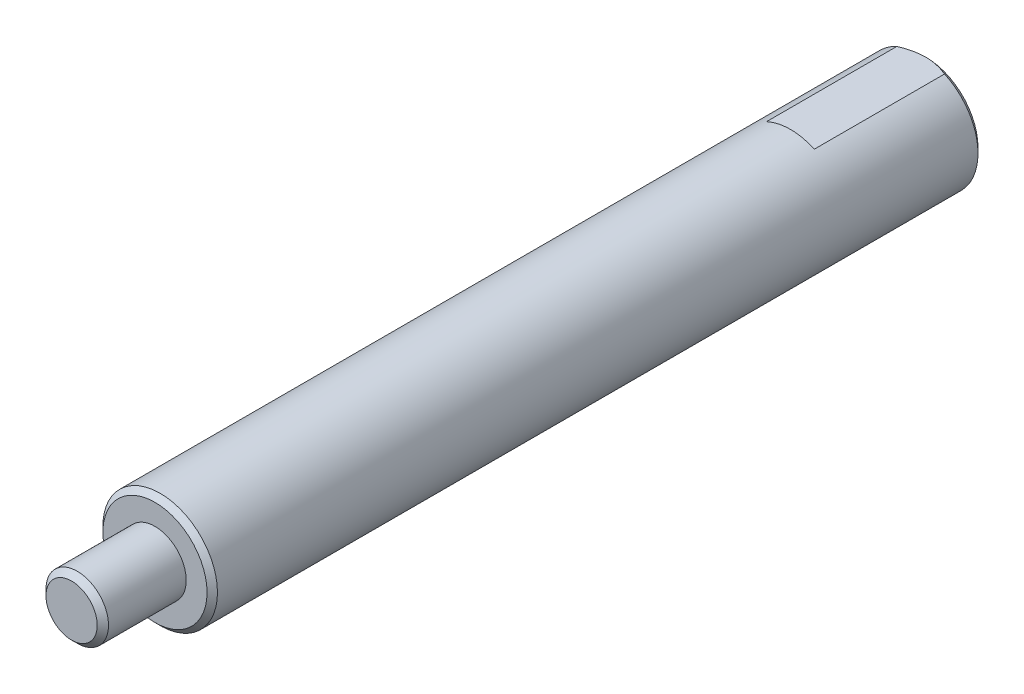
ISO-10303-21;
HEADER;
FILE_DESCRIPTION(('STEP AP214'),'2;1');
FILE_NAME('part.step','',(''),(''),'','','');
FILE_SCHEMA(('AUTOMOTIVE_DESIGN { 1 0 10303 214 1 1 1 1 }'));
ENDSEC;
DATA;
#1=APPLICATION_CONTEXT('core data for automotive mechanical design processes');
#2=APPLICATION_PROTOCOL_DEFINITION('international standard','automotive_design',2000,#1);
#3=PRODUCT_CONTEXT('',#1,'mechanical');
#4=PRODUCT('Part','Part','',(#3));
#5=PRODUCT_RELATED_PRODUCT_CATEGORY('part','',(#4));
#6=PRODUCT_DEFINITION_FORMATION('','',#4);
#7=PRODUCT_DEFINITION_CONTEXT('part definition',#1,'design');
#8=PRODUCT_DEFINITION('design','',#6,#7);
#9=PRODUCT_DEFINITION_SHAPE('','',#8);
#10=(LENGTH_UNIT() NAMED_UNIT(*) SI_UNIT(.MILLI.,.METRE.));
#11=(NAMED_UNIT(*) PLANE_ANGLE_UNIT() SI_UNIT($,.RADIAN.));
#12=(NAMED_UNIT(*) SI_UNIT($,.STERADIAN.) SOLID_ANGLE_UNIT());
#13=UNCERTAINTY_MEASURE_WITH_UNIT(LENGTH_MEASURE(1.E-05),#10,'distance_accuracy_value','');
#14=(GEOMETRIC_REPRESENTATION_CONTEXT(3) GLOBAL_UNCERTAINTY_ASSIGNED_CONTEXT((#13)) GLOBAL_UNIT_ASSIGNED_CONTEXT((#10,
#11,#12)) REPRESENTATION_CONTEXT('',''));
#15=CARTESIAN_POINT('',(0.,0.,0.));
#16=DIRECTION('',(0.,0.,1.));
#17=DIRECTION('',(1.,0.,0.));
#18=AXIS2_PLACEMENT_3D('',#15,#16,#17);
#19=CARTESIAN_POINT('',(0.,0.,0.499999999999987));
#20=DIRECTION('',(0.,0.,1.));
#21=DIRECTION('',(1.,0.,0.));
#22=AXIS2_PLACEMENT_3D('',#19,#20,#21);
#23=CONICAL_SURFACE('',#22,5.5,0.78539816339745);
#24=CARTESIAN_POINT('',(14.6848091307526,5.,10.5126921972504));
#25=CARTESIAN_POINT('',(14.4453208226167,5.,10.2859896541325));
#26=CARTESIAN_POINT('',(14.2055496886511,5.,10.0595855916861));
#27=CARTESIAN_POINT('',(13.7253433237666,5.,9.60748006149905));
#28=CARTESIAN_POINT('',(13.4849080888773,5.,9.38177859797621));
#29=CARTESIAN_POINT('',(12.7618962256915,5.,8.70536049882658));
#30=CARTESIAN_POINT('',(12.2781765081115,5.,8.25586410270802));
#31=CARTESIAN_POINT('',(11.2855202754839,5.,7.34194274282295));
#32=CARTESIAN_POINT('',(10.7764003173807,5.,6.87771631839148));
#33=CARTESIAN_POINT('',(10.0081237078525,5.,6.18705169530895));
#34=CARTESIAN_POINT('',(9.75140731219671,5.,5.95789999795168));
#35=CARTESIAN_POINT('',(9.23598125315536,5.,5.50185127115901));
#36=CARTESIAN_POINT('',(8.97727160895969,5.,5.27495422006517));
#37=CARTESIAN_POINT('',(8.45777334373332,5.,4.82431921159367));
#38=CARTESIAN_POINT('',(8.19698831207967,5.,4.60057712329845));
#39=CARTESIAN_POINT('',(7.67233583018279,5.,4.15670009726201));
#40=CARTESIAN_POINT('',(7.40846821574941,5.,3.93656535317608));
#41=CARTESIAN_POINT('',(6.87588577364978,5.,3.50025684420237));
#42=CARTESIAN_POINT('',(6.60715699098739,5.,3.28410005066111));
#43=CARTESIAN_POINT('',(6.06467897085509,5.,2.85824880719017));
#44=CARTESIAN_POINT('',(5.79093054202079,5.,2.64855333071796));
#45=CARTESIAN_POINT('',(5.24247824545985,5.,2.24225256251797));
#46=CARTESIAN_POINT('',(4.96790940819442,5.,2.04546689887262));
#47=CARTESIAN_POINT('',(4.54965992503179,5.,1.75937405975095));
#48=CARTESIAN_POINT('',(4.40911425501476,5.,1.66548481679902));
#49=CARTESIAN_POINT('',(4.12560555295647,5.,1.48143277641836));
#50=CARTESIAN_POINT('',(3.98264266122834,5.,1.39126976373143));
#51=CARTESIAN_POINT('',(3.69483138879456,5.,1.21601413329325));
#52=CARTESIAN_POINT('',(3.54999993591866,5.,1.130893824596));
#53=CARTESIAN_POINT('',(3.25720950323682,5.,0.966134750499005));
#54=CARTESIAN_POINT('',(3.10925012756179,5.,0.886496684425017));
#55=CARTESIAN_POINT('',(2.81011276522684,5.,0.734125373534754));
#56=CARTESIAN_POINT('',(2.65894061859049,5.,0.661380726321641));
#57=CARTESIAN_POINT('',(2.35286256329063,5.,0.524242686166215));
#58=CARTESIAN_POINT('',(2.1979578875244,5.,0.459846579258829));
#59=CARTESIAN_POINT('',(1.96757107505039,5.,0.372774300731312));
#60=CARTESIAN_POINT('',(1.8935907421667,5.,0.346101437024875));
#61=CARTESIAN_POINT('',(1.74478391072055,5.,0.295222264195111));
#62=CARTESIAN_POINT('',(1.6699573739292,5.,0.271016067006724));
#63=CARTESIAN_POINT('',(1.44419485912741,5.,0.20241783221721));
#64=CARTESIAN_POINT('',(1.29200049197922,5.,0.162055560028218));
#65=CARTESIAN_POINT('',(0.985646477349409,5.,0.0940487123556885));
#66=CARTESIAN_POINT('',(0.831502220582748,5.,0.066335485409596));
#67=CARTESIAN_POINT('',(0.521341182897074,5.,0.0247588689838173));
#68=CARTESIAN_POINT('',(0.365324622093103,5.,0.0108938672889431));
#69=CARTESIAN_POINT('',(0.0516160098074453,5.,-0.00220571628050168));
#70=CARTESIAN_POINT('',(-0.106080254029352,5.,-0.00134130349868332));
#71=CARTESIAN_POINT('',(-0.420679844237957,5.,0.0152055027274913));
#72=CARTESIAN_POINT('',(-0.577583163483161,5.,0.0308880291126336));
#73=CARTESIAN_POINT('',(-0.890071145811222,5.,0.0762385891218209));
#74=CARTESIAN_POINT('',(-1.04564624986794,5.,0.105971488681442));
#75=CARTESIAN_POINT('',(-1.35387421816561,5.,0.177884717281022));
#76=CARTESIAN_POINT('',(-1.50652647420588,5.,0.220067607636083));
#77=CARTESIAN_POINT('',(-1.89899228144049,5.,0.34355635845916));
#78=CARTESIAN_POINT('',(-2.13618939052783,5.,0.43315513583937));
#79=CARTESIAN_POINT('',(-2.60192397109251,5.,0.632544932175513));
#80=CARTESIAN_POINT('',(-2.83045405488686,5.,0.742352730382461));
#81=CARTESIAN_POINT('',(-3.16847602424729,5.,0.918609391765225));
#82=CARTESIAN_POINT('',(-3.28087217249437,5.,0.979600606049442));
#83=CARTESIAN_POINT('',(-3.50386518493594,5.,1.10479681410001));
#84=CARTESIAN_POINT('',(-3.61446202600279,5.,1.16900184913246));
#85=CARTESIAN_POINT('',(-3.8339612658412,5.,1.30012039469567));
#86=CARTESIAN_POINT('',(-3.94286443721366,5.,1.36703261693912));
#87=CARTESIAN_POINT('',(-4.15918024646885,5.,1.50320934076161));
#88=CARTESIAN_POINT('',(-4.26659294268099,5.,1.57247374992055));
#89=CARTESIAN_POINT('',(-4.62241235734309,5.,1.80671898738884));
#90=CARTESIAN_POINT('',(-4.86786587008812,5.,1.97619150842304));
#91=CARTESIAN_POINT('',(-5.35312692377562,5.,2.32306349681885));
#92=CARTESIAN_POINT('',(-5.59293322072365,5.,2.5004646862587));
#93=CARTESIAN_POINT('',(-6.06824445724704,5.,2.86127560728365));
#94=CARTESIAN_POINT('',(-6.30374612411139,5.,3.04468963665742));
#95=CARTESIAN_POINT('',(-6.77116765089326,5.,3.41597165684269));
#96=CARTESIAN_POINT('',(-7.00308779793934,5.,3.60383928751785));
#97=CARTESIAN_POINT('',(-7.46479831203283,5.,3.98364854892019));
#98=CARTESIAN_POINT('',(-7.69457957218839,5.,4.17560122632345));
#99=CARTESIAN_POINT('',(-8.15180534086165,5.,4.56227258082257));
#100=CARTESIAN_POINT('',(-8.37924980937879,5.,4.75699130513138));
#101=CARTESIAN_POINT('',(-8.83212152767317,5.,5.14856830192779));
#102=CARTESIAN_POINT('',(-9.05754957794669,5.,5.34542564979234));
#103=CARTESIAN_POINT('',(-9.50680949169871,5.,5.740954496332));
#104=CARTESIAN_POINT('',(-9.73064134364098,5.,5.93962600809503));
#105=CARTESIAN_POINT('',(-10.3554269609869,5.,6.4979230401996));
#106=CARTESIAN_POINT('',(-10.754889456792,5.,6.85921712232002));
#107=CARTESIAN_POINT('',(-11.550652043519,5.,7.58535654201273));
#108=CARTESIAN_POINT('',(-11.9469517546504,5.,7.95020229473564));
#109=CARTESIAN_POINT('',(-12.7346046209227,5.,8.68021687945507));
#110=CARTESIAN_POINT('',(-13.1259732089032,5.,9.0453690788511));
#111=CARTESIAN_POINT('',(-13.9067337252457,5.,9.77766414097995));
#112=CARTESIAN_POINT('',(-14.2961259422759,5.,10.1448066957958));
#113=CARTESIAN_POINT('',(-14.6848091307526,5.,10.5126921972504));
#114=B_SPLINE_CURVE_WITH_KNOTS('',3,(#24,#25,#26,#27,#28,#29,#30,#31,#32,#33,#34,#35,#36,#37,
#38,#39,#40,#41,#42,#43,#44,#45,#46,#47,#48,#49,#50,#51,#52,#53,#54,#55,#56,#57,#58,#59,#60,#61,
#62,#63,#64,#65,#66,#67,#68,#69,#70,#71,#72,#73,#74,#75,#76,#77,#78,#79,#80,#81,#82,#83,#84,#85,
#86,#87,#88,#89,#90,#91,#92,#93,#94,#95,#96,#97,#98,#99,#100,#101,#102,#103,#104,#105,#106,#107,
#108,#109,#110,#111,#112,#113),.UNSPECIFIED.,.F.,.F.,(4,2,2,2,2,2,2,2,2,2,2,2,2,2,2,2,2,2,2,2,2,
2,2,2,2,2,2,2,2,2,2,2,2,2,2,2,2,2,2,2,2,2,2,2,4),(0.,0.989311923310714,1.97862977419092,
3.95959337600444,6.02651317448656,7.05884240046668,8.09116170015311,9.12197286482421,
10.1528391870693,11.1873903696083,12.2217763312279,13.2349233326133,13.7419424161499,
14.2489321689684,14.7528143978997,15.256760784397,15.759858485699,16.2627922263955,
16.4986794127492,16.7345772986728,17.2064516788896,17.6757336299653,18.1449609407031,
18.6173431093418,19.0897295159999,19.5643184047903,20.039004998071,20.7982977886037,
21.5582238763945,21.941816072922,22.3254131961146,22.7088298733653,23.0922315031281,
23.9868071792121,24.8815781072258,25.7770031658049,26.6723560620082,27.5705534283762,
28.4687661443107,29.3666048627681,30.2644500636279,31.8802558929101,33.4962529155443,
35.1020309687598,36.7075673131427),.UNSPECIFIED.);
#115=CARTESIAN_POINT('',(2.29128784747799,5.,0.499999999999968));
#116=VERTEX_POINT('',#115);
#117=CARTESIAN_POINT('',(0.,5.00000000000001,0.));
#118=VERTEX_POINT('',#117);
#119=EDGE_CURVE('E56',#116,#118,#114,.T.);
#120=ORIENTED_EDGE('',*,*,#119,.F.);
#121=CARTESIAN_POINT('',(0.,0.,0.499999999999987));
#122=DIRECTION('',(0.,0.,1.));
#123=DIRECTION('',(1.,0.,0.));
#124=AXIS2_PLACEMENT_3D('',#121,#122,#123);
#125=CIRCLE('',#124,5.5);
#126=CARTESIAN_POINT('',(2.29128784747792,-5.,0.499999999999986));
#127=VERTEX_POINT('',#126);
#128=EDGE_CURVE('E125',#127,#116,#125,.T.);
#129=ORIENTED_EDGE('',*,*,#128,.F.);
#130=CARTESIAN_POINT('',(-14.6848091307526,-5.,10.5126921972504));
#131=CARTESIAN_POINT('',(-14.4453208226167,-5.,10.2859896541325));
#132=CARTESIAN_POINT('',(-14.2055496886511,-5.,10.0595855916861));
#133=CARTESIAN_POINT('',(-13.7253433237666,-5.,9.60748006149905));
#134=CARTESIAN_POINT('',(-13.4849080888773,-5.,9.38177859797621));
#135=CARTESIAN_POINT('',(-12.7618962256915,-5.,8.70536049882658));
#136=CARTESIAN_POINT('',(-12.2781765081115,-5.,8.25586410270802));
#137=CARTESIAN_POINT('',(-11.2855202754839,-5.,7.34194274282295));
#138=CARTESIAN_POINT('',(-10.7764003173807,-5.,6.87771631839148));
#139=CARTESIAN_POINT('',(-10.0081237078525,-5.,6.18705169530895));
#140=CARTESIAN_POINT('',(-9.75140731219672,-5.,5.95789999795169));
#141=CARTESIAN_POINT('',(-9.23598125315536,-5.,5.50185127115901));
#142=CARTESIAN_POINT('',(-8.9772716089597,-5.,5.27495422006518));
#143=CARTESIAN_POINT('',(-8.45777334373332,-5.,4.82431921159367));
#144=CARTESIAN_POINT('',(-8.19698831207967,-5.,4.60057712329845));
#145=CARTESIAN_POINT('',(-7.6723358301828,-5.,4.15670009726201));
#146=CARTESIAN_POINT('',(-7.40846821574941,-5.,3.93656535317608));
#147=CARTESIAN_POINT('',(-6.87588577364978,-5.,3.50025684420237));
#148=CARTESIAN_POINT('',(-6.60715699098739,-5.,3.28410005066111));
#149=CARTESIAN_POINT('',(-6.0646789708551,-5.,2.85824880719017));
#150=CARTESIAN_POINT('',(-5.79093054202079,-5.,2.64855333071797));
#151=CARTESIAN_POINT('',(-5.24247824545985,-5.,2.24225256251797));
#152=CARTESIAN_POINT('',(-4.96790940819442,-5.,2.04546689887262));
#153=CARTESIAN_POINT('',(-4.5496599250318,-5.,1.75937405975095));
#154=CARTESIAN_POINT('',(-4.40911425501477,-5.,1.66548481679902));
#155=CARTESIAN_POINT('',(-4.12560555295648,-5.,1.48143277641836));
#156=CARTESIAN_POINT('',(-3.98264266122835,-5.,1.39126976373143));
#157=CARTESIAN_POINT('',(-3.69483138879457,-5.,1.21601413329326));
#158=CARTESIAN_POINT('',(-3.54999993591867,-5.,1.13089382459601));
#159=CARTESIAN_POINT('',(-3.25720950323683,-5.,0.966134750499011));
#160=CARTESIAN_POINT('',(-3.1092501275618,-5.,0.886496684425023));
#161=CARTESIAN_POINT('',(-2.81011276522685,-5.,0.734125373534759));
#162=CARTESIAN_POINT('',(-2.6589406185905,-5.,0.661380726321646));
#163=CARTESIAN_POINT('',(-2.35286256329064,-5.,0.52424268616622));
#164=CARTESIAN_POINT('',(-2.19795788752441,-5.,0.459846579258833));
#165=CARTESIAN_POINT('',(-1.9675710750504,-5.,0.372774300731315));
#166=CARTESIAN_POINT('',(-1.89359074216671,-5.,0.346101437024878));
#167=CARTESIAN_POINT('',(-1.74478391072056,-5.,0.295222264195114));
#168=CARTESIAN_POINT('',(-1.66995737392921,-5.,0.271016067006727));
#169=CARTESIAN_POINT('',(-1.44419485912741,-5.,0.202417832217213));
#170=CARTESIAN_POINT('',(-1.29200049197923,-5.,0.16205556002822));
#171=CARTESIAN_POINT('',(-0.985646477349418,-5.,0.0940487123556907));
#172=CARTESIAN_POINT('',(-0.831502220582757,-5.,0.0663354854095982));
#173=CARTESIAN_POINT('',(-0.521341182897083,-5.,0.0247588689838186));
#174=CARTESIAN_POINT('',(-0.365324622093111,-5.,0.0108938672889437));
#175=CARTESIAN_POINT('',(-0.0516160098074518,-5.,-0.00220571628050229));
#176=CARTESIAN_POINT('',(0.106080254029347,-5.,-0.00134130349868432));
#177=CARTESIAN_POINT('',(0.420679844237952,-5.,0.0152055027274903));
#178=CARTESIAN_POINT('',(0.577583163483156,-5.,0.0308880291126329));
#179=CARTESIAN_POINT('',(0.890071145811216,-5.,0.0762385891218198));
#180=CARTESIAN_POINT('',(1.04564624986793,-5.,0.10597148868144));
#181=CARTESIAN_POINT('',(1.3538742181656,-5.,0.17788471728102));
#182=CARTESIAN_POINT('',(1.50652647420588,-5.,0.220067607636081));
#183=CARTESIAN_POINT('',(1.89899228144048,-5.,0.343556358459158));
#184=CARTESIAN_POINT('',(2.13618939052782,-5.,0.433155135839368));
#185=CARTESIAN_POINT('',(2.60192397109251,-5.,0.63254493217551));
#186=CARTESIAN_POINT('',(2.83045405488685,-5.,0.742352730382457));
#187=CARTESIAN_POINT('',(3.16847602424728,-5.,0.918609391765221));
#188=CARTESIAN_POINT('',(3.28087217249436,-5.,0.979600606049437));
#189=CARTESIAN_POINT('',(3.50386518493593,-5.,1.1047968141));
#190=CARTESIAN_POINT('',(3.61446202600278,-5.,1.16900184913246));
#191=CARTESIAN_POINT('',(3.83396126584119,-5.,1.30012039469567));
#192=CARTESIAN_POINT('',(3.94286443721365,-5.,1.36703261693911));
#193=CARTESIAN_POINT('',(4.15918024646884,-5.,1.5032093407616));
#194=CARTESIAN_POINT('',(4.26659294268098,-5.,1.57247374992054));
#195=CARTESIAN_POINT('',(4.62241235734308,-5.,1.80671898738884));
#196=CARTESIAN_POINT('',(4.86786587008811,-5.,1.97619150842303));
#197=CARTESIAN_POINT('',(5.35312692377561,-5.,2.32306349681884));
#198=CARTESIAN_POINT('',(5.59293322072363,-5.,2.5004646862587));
#199=CARTESIAN_POINT('',(6.06824445724703,-5.,2.86127560728364));
#200=CARTESIAN_POINT('',(6.30374612411138,-5.,3.04468963665741));
#201=CARTESIAN_POINT('',(6.77116765089325,-5.,3.41597165684268));
#202=CARTESIAN_POINT('',(7.00308779793934,-5.,3.60383928751784));
#203=CARTESIAN_POINT('',(7.46479831203282,-5.,3.98364854892018));
#204=CARTESIAN_POINT('',(7.69457957218838,-5.,4.17560122632344));
#205=CARTESIAN_POINT('',(8.15180534086164,-5.,4.56227258082257));
#206=CARTESIAN_POINT('',(8.37924980937878,-5.,4.75699130513138));
#207=CARTESIAN_POINT('',(8.83212152767316,-5.,5.14856830192779));
#208=CARTESIAN_POINT('',(9.05754957794669,-5.,5.34542564979233));
#209=CARTESIAN_POINT('',(9.50680949169871,-5.,5.74095449633199));
#210=CARTESIAN_POINT('',(9.73064134364097,-5.,5.93962600809503));
#211=CARTESIAN_POINT('',(10.3554269609869,-5.,6.4979230401996));
#212=CARTESIAN_POINT('',(10.754889456792,-5.,6.85921712232001));
#213=CARTESIAN_POINT('',(11.550652043519,-5.,7.58535654201273));
#214=CARTESIAN_POINT('',(11.9469517546504,-5.,7.95020229473563));
#215=CARTESIAN_POINT('',(12.7346046209227,-5.,8.68021687945506));
#216=CARTESIAN_POINT('',(13.1259732089032,-5.,9.04536907885109));
#217=CARTESIAN_POINT('',(13.9067337252457,-5.,9.77766414097995));
#218=CARTESIAN_POINT('',(14.2961259422759,-5.,10.1448066957958));
#219=CARTESIAN_POINT('',(14.6848091307526,-5.,10.5126921972504));
#220=B_SPLINE_CURVE_WITH_KNOTS('',3,(#130,#131,#132,#133,#134,#135,#136,#137,#138,#139,#140,
#141,#142,#143,#144,#145,#146,#147,#148,#149,#150,#151,#152,#153,#154,#155,#156,#157,#158,#159,
#160,#161,#162,#163,#164,#165,#166,#167,#168,#169,#170,#171,#172,#173,#174,#175,#176,#177,#178,
#179,#180,#181,#182,#183,#184,#185,#186,#187,#188,#189,#190,#191,#192,#193,#194,#195,#196,#197,
#198,#199,#200,#201,#202,#203,#204,#205,#206,#207,#208,#209,#210,#211,#212,#213,#214,#215,#216,
#217,#218,#219),.UNSPECIFIED.,.F.,.F.,(4,2,2,2,2,2,2,2,2,2,2,2,2,2,2,2,2,2,2,2,2,2,2,2,2,2,2,2,
2,2,2,2,2,2,2,2,2,2,2,2,2,2,2,2,4),(0.,0.98931192331071,1.97862977419091,3.95959337600444,
6.02651317448655,7.05884240046668,8.0911617001531,9.1219728648242,10.1528391870693,
11.1873903696083,12.2217763312279,13.2349233326133,13.7419424161499,14.2489321689684,
14.7528143978997,15.2567607843969,15.759858485699,16.2627922263955,16.4986794127492,
16.7345772986728,17.2064516788896,17.6757336299653,18.1449609407031,18.6173431093418,
19.0897295159999,19.5643184047903,20.0390049980709,20.7982977886037,21.5582238763945,
21.941816072922,22.3254131961146,22.7088298733652,23.092231503128,23.9868071792121,
24.8815781072258,25.7770031658048,26.6723560620081,27.5705534283762,28.4687661443107,
29.3666048627681,30.2644500636279,31.8802558929101,33.4962529155443,35.1020309687598,
36.7075673131427),.UNSPECIFIED.);
#221=CARTESIAN_POINT('',(0.,-5.00000000000001,0.));
#222=VERTEX_POINT('',#221);
#223=EDGE_CURVE('E141',#222,#127,#220,.T.);
#224=ORIENTED_EDGE('',*,*,#223,.F.);
#225=CARTESIAN_POINT('',(0.,0.,0.));
#226=DIRECTION('',(0.,0.,1.));
#227=DIRECTION('',(1.,0.,0.));
#228=AXIS2_PLACEMENT_3D('',#225,#226,#227);
#229=CIRCLE('',#228,5.00000000000001);
#230=EDGE_CURVE('E132',#118,#222,#229,.F.);
#231=ORIENTED_EDGE('',*,*,#230,.F.);
#232=EDGE_LOOP('',(#120,#129,#224,#231));
#233=FACE_BOUND('',#232,.T.);
#234=ADVANCED_FACE('F41',(#233),#23,.T.);
#235=CARTESIAN_POINT('',(0.,0.,74.));
#236=DIRECTION('',(0.,0.,1.));
#237=DIRECTION('',(1.,0.,0.));
#238=AXIS2_PLACEMENT_3D('',#235,#236,#237);
#239=PLANE('',#238);
#240=CARTESIAN_POINT('',(0.,0.,74.));
#241=DIRECTION('',(0.,0.,1.));
#242=DIRECTION('',(1.,0.,0.));
#243=AXIS2_PLACEMENT_3D('',#240,#241,#242);
#244=CIRCLE('',#243,5.00000000000001);
#245=CARTESIAN_POINT('',(5.00000000000001,0.,74.));
#246=VERTEX_POINT('',#245);
#247=EDGE_CURVE('E131',#246,#246,#244,.T.);
#248=ORIENTED_EDGE('',*,*,#247,.T.);
#249=EDGE_LOOP('',(#248));
#250=FACE_BOUND('',#249,.T.);
#251=CARTESIAN_POINT('',(0.,0.,74.));
#252=DIRECTION('',(0.,0.,-1.));
#253=DIRECTION('',(-1.,0.,0.));
#254=AXIS2_PLACEMENT_3D('',#251,#252,#253);
#255=CIRCLE('',#254,3.);
#256=CARTESIAN_POINT('',(-3.,0.,74.));
#257=VERTEX_POINT('',#256);
#258=EDGE_CURVE('E100',#257,#257,#255,.T.);
#259=ORIENTED_EDGE('',*,*,#258,.T.);
#260=EDGE_LOOP('',(#259));
#261=FACE_BOUND('',#260,.T.);
#262=ADVANCED_FACE('F177',(#250,#261),#239,.T.);
#263=CARTESIAN_POINT('',(0.,0.,74.));
#264=DIRECTION('',(0.,0.,-1.));
#265=DIRECTION('',(-1.,0.,0.));
#266=AXIS2_PLACEMENT_3D('',#263,#264,#265);
#267=CYLINDRICAL_SURFACE('',#266,5.5);
#268=CARTESIAN_POINT('',(0.,0.,13.));
#269=DIRECTION('',(0.,0.,-1.));
#270=DIRECTION('',(-1.,0.,0.));
#271=AXIS2_PLACEMENT_3D('',#268,#269,#270);
#272=CIRCLE('',#271,5.5);
#273=CARTESIAN_POINT('',(-2.29128784747792,5.,13.));
#274=VERTEX_POINT('',#273);
#275=CARTESIAN_POINT('',(2.29128784747792,5.,13.));
#276=VERTEX_POINT('',#275);
#277=EDGE_CURVE('E11',#274,#276,#272,.T.);
#278=ORIENTED_EDGE('',*,*,#277,.F.);
#279=DIRECTION('',(0.,0.,-1.));
#280=VECTOR('',#279,1.);
#281=CARTESIAN_POINT('',(-2.29128784747792,5.,74.));
#282=LINE('',#281,#280);
#283=CARTESIAN_POINT('',(-2.29128784747792,5.,0.499999999999986));
#284=VERTEX_POINT('',#283);
#285=EDGE_CURVE('E117',#274,#284,#282,.T.);
#286=ORIENTED_EDGE('',*,*,#285,.T.);
#287=CARTESIAN_POINT('',(-2.29128784747799,-5.,0.499999999999967));
#288=VERTEX_POINT('',#287);
#289=EDGE_CURVE('E108',#284,#288,#125,.T.);
#290=ORIENTED_EDGE('',*,*,#289,.T.);
#291=DIRECTION('',(0.,0.,-1.));
#292=VECTOR('',#291,1.);
#293=CARTESIAN_POINT('',(-2.29128784747792,-5.,74.));
#294=LINE('',#293,#292);
#295=CARTESIAN_POINT('',(-2.29128784747792,-5.,13.));
#296=VERTEX_POINT('',#295);
#297=EDGE_CURVE('E97',#288,#296,#294,.F.);
#298=ORIENTED_EDGE('',*,*,#297,.T.);
#299=CARTESIAN_POINT('',(0.,0.,13.));
#300=DIRECTION('',(0.,0.,1.));
#301=DIRECTION('',(1.,0.,0.));
#302=AXIS2_PLACEMENT_3D('',#299,#300,#301);
#303=CIRCLE('',#302,5.5);
#304=CARTESIAN_POINT('',(2.29128784747792,-5.,13.));
#305=VERTEX_POINT('',#304);
#306=EDGE_CURVE('E49',#296,#305,#303,.T.);
#307=ORIENTED_EDGE('',*,*,#306,.T.);
#308=DIRECTION('',(0.,0.,-1.));
#309=VECTOR('',#308,1.);
#310=CARTESIAN_POINT('',(2.29128784747792,-5.,74.));
#311=LINE('',#310,#309);
#312=EDGE_CURVE('E98',#305,#127,#311,.T.);
#313=ORIENTED_EDGE('',*,*,#312,.T.);
#314=ORIENTED_EDGE('',*,*,#128,.T.);
#315=DIRECTION('',(0.,0.,-1.));
#316=VECTOR('',#315,1.);
#317=CARTESIAN_POINT('',(2.29128784747792,5.,74.));
#318=LINE('',#317,#316);
#319=EDGE_CURVE('E110',#116,#276,#318,.F.);
#320=ORIENTED_EDGE('',*,*,#319,.T.);
#321=EDGE_LOOP('',(#278,#286,#290,#298,#307,#313,#314,#320));
#322=FACE_BOUND('',#321,.T.);
#323=CARTESIAN_POINT('',(0.,0.,73.5));
#324=DIRECTION('',(0.,0.,1.));
#325=DIRECTION('',(1.,0.,0.));
#326=AXIS2_PLACEMENT_3D('',#323,#324,#325);
#327=CIRCLE('',#326,5.5);
#328=CARTESIAN_POINT('',(5.5,0.,73.5));
#329=VERTEX_POINT('',#328);
#330=EDGE_CURVE('E122',#329,#329,#327,.F.);
#331=ORIENTED_EDGE('',*,*,#330,.T.);
#332=EDGE_LOOP('',(#331));
#333=FACE_BOUND('',#332,.T.);
#334=ADVANCED_FACE('F104',(#322,#333),#267,.T.);
#335=CARTESIAN_POINT('',(0.,0.,0.));
#336=DIRECTION('',(0.,0.,1.));
#337=DIRECTION('',(1.,0.,0.));
#338=AXIS2_PLACEMENT_3D('',#335,#336,#337);
#339=PLANE('',#338);
#340=CARTESIAN_POINT('',(0.,0.,0.));
#341=DIRECTION('',(0.,0.,1.));
#342=DIRECTION('',(1.,0.,0.));
#343=AXIS2_PLACEMENT_3D('',#340,#341,#342);
#344=CIRCLE('',#343,2.6);
#345=CARTESIAN_POINT('',(2.6,0.,0.));
#346=VERTEX_POINT('',#345);
#347=EDGE_CURVE('E138',#346,#346,#344,.T.);
#348=ORIENTED_EDGE('',*,*,#347,.T.);
#349=EDGE_LOOP('',(#348));
#350=FACE_BOUND('',#349,.T.);
#351=EDGE_CURVE('E128',#222,#118,#229,.F.);
#352=ORIENTED_EDGE('',*,*,#351,.T.);
#353=ORIENTED_EDGE('',*,*,#230,.T.);
#354=EDGE_LOOP('',(#352,#353));
#355=FACE_BOUND('',#354,.T.);
#356=ADVANCED_FACE('F181',(#350,#355),#339,.F.);
#357=EDGE_CURVE('E149',#118,#284,#114,.T.);
#358=ORIENTED_EDGE('',*,*,#357,.F.);
#359=ORIENTED_EDGE('',*,*,#351,.F.);
#360=EDGE_CURVE('E64',#288,#222,#220,.T.);
#361=ORIENTED_EDGE('',*,*,#360,.F.);
#362=ORIENTED_EDGE('',*,*,#289,.F.);
#363=EDGE_LOOP('',(#358,#359,#361,#362));
#364=FACE_BOUND('',#363,.T.);
#365=ADVANCED_FACE('F155',(#364),#23,.T.);
#366=CARTESIAN_POINT('',(0.,0.,74.));
#367=DIRECTION('',(0.,0.,-1.));
#368=DIRECTION('',(-1.,0.,0.));
#369=AXIS2_PLACEMENT_3D('',#366,#367,#368);
#370=CONICAL_SURFACE('',#369,5.00000000000001,0.78539816339745);
#371=ORIENTED_EDGE('',*,*,#330,.F.);
#372=EDGE_LOOP('',(#371));
#373=FACE_BOUND('',#372,.T.);
#374=ORIENTED_EDGE('',*,*,#247,.F.);
#375=EDGE_LOOP('',(#374));
#376=FACE_BOUND('',#375,.T.);
#377=ADVANCED_FACE('F170',(#373,#376),#370,.T.);
#378=CARTESIAN_POINT('',(0.,0.,12.4));
#379=DIRECTION('',(0.,0.,-1.));
#380=DIRECTION('',(-1.,0.,0.));
#381=AXIS2_PLACEMENT_3D('',#378,#379,#380);
#382=CONICAL_SURFACE('',#381,2.1,1.02974425867665);
#383=CARTESIAN_POINT('',(0.,0.,13.6618072999579));
#384=VERTEX_POINT('',#383);
#385=VERTEX_LOOP('',#384);
#386=FACE_BOUND('',#385,.T.);
#387=CARTESIAN_POINT('',(0.,0.,12.4));
#388=DIRECTION('',(0.,0.,-1.));
#389=DIRECTION('',(-1.,0.,0.));
#390=AXIS2_PLACEMENT_3D('',#387,#388,#389);
#391=CIRCLE('',#390,2.1);
#392=CARTESIAN_POINT('',(-2.1,0.,12.4));
#393=VERTEX_POINT('',#392);
#394=EDGE_CURVE('E119',#393,#393,#391,.T.);
#395=ORIENTED_EDGE('',*,*,#394,.T.);
#396=EDGE_LOOP('',(#395));
#397=FACE_BOUND('',#396,.T.);
#398=ADVANCED_FACE('F166',(#386,#397),#382,.F.);
#399=CARTESIAN_POINT('',(0.,0.,0.));
#400=DIRECTION('',(0.,0.,-1.));
#401=DIRECTION('',(-1.,0.,0.));
#402=AXIS2_PLACEMENT_3D('',#399,#400,#401);
#403=CYLINDRICAL_SURFACE('',#402,2.1);
#404=CARTESIAN_POINT('',(0.,0.,0.5));
#405=DIRECTION('',(0.,0.,1.));
#406=DIRECTION('',(1.,0.,0.));
#407=AXIS2_PLACEMENT_3D('',#404,#405,#406);
#408=CIRCLE('',#407,2.1);
#409=CARTESIAN_POINT('',(2.1,0.,0.5));
#410=VERTEX_POINT('',#409);
#411=EDGE_CURVE('E135',#410,#410,#408,.F.);
#412=ORIENTED_EDGE('',*,*,#411,.T.);
#413=EDGE_LOOP('',(#412));
#414=FACE_BOUND('',#413,.T.);
#415=ORIENTED_EDGE('',*,*,#394,.F.);
#416=EDGE_LOOP('',(#415));
#417=FACE_BOUND('',#416,.T.);
#418=ADVANCED_FACE('F163',(#414,#417),#403,.F.);
#419=CARTESIAN_POINT('',(0.,0.,0.5));
#420=DIRECTION('',(0.,0.,-1.));
#421=DIRECTION('',(-1.,0.,0.));
#422=AXIS2_PLACEMENT_3D('',#419,#420,#421);
#423=CONICAL_SURFACE('',#422,2.1,0.785398163397455);
#424=ORIENTED_EDGE('',*,*,#347,.F.);
#425=EDGE_LOOP('',(#424));
#426=FACE_BOUND('',#425,.T.);
#427=ORIENTED_EDGE('',*,*,#411,.F.);
#428=EDGE_LOOP('',(#427));
#429=FACE_BOUND('',#428,.T.);
#430=ADVANCED_FACE('F43',(#426,#429),#423,.F.);
#431=CARTESIAN_POINT('',(0.,0.,13.));
#432=DIRECTION('',(0.,0.,1.));
#433=DIRECTION('',(1.,0.,0.));
#434=AXIS2_PLACEMENT_3D('',#431,#432,#433);
#435=PLANE('',#434);
#436=DIRECTION('',(1.,0.,0.));
#437=VECTOR('',#436,1.);
#438=CARTESIAN_POINT('',(5.,-5.,13.));
#439=LINE('',#438,#437);
#440=EDGE_CURVE('E92',#296,#305,#439,.T.);
#441=ORIENTED_EDGE('',*,*,#440,.T.);
#442=ORIENTED_EDGE('',*,*,#306,.F.);
#443=EDGE_LOOP('',(#441,#442));
#444=FACE_BOUND('',#443,.T.);
#445=ADVANCED_FACE('F91',(#444),#435,.F.);
#446=CARTESIAN_POINT('',(5.,-5.,13.));
#447=DIRECTION('',(0.,1.,0.));
#448=DIRECTION('',(0.,0.,1.));
#449=AXIS2_PLACEMENT_3D('',#446,#447,#448);
#450=PLANE('',#449);
#451=ORIENTED_EDGE('',*,*,#440,.F.);
#452=ORIENTED_EDGE('',*,*,#297,.F.);
#453=ORIENTED_EDGE('',*,*,#360,.T.);
#454=ORIENTED_EDGE('',*,*,#223,.T.);
#455=ORIENTED_EDGE('',*,*,#312,.F.);
#456=EDGE_LOOP('',(#451,#452,#453,#454,#455));
#457=FACE_BOUND('',#456,.T.);
#458=ADVANCED_FACE('F96',(#457),#450,.F.);
#459=CARTESIAN_POINT('',(0.,0.,13.));
#460=DIRECTION('',(0.,0.,-1.));
#461=DIRECTION('',(-1.,0.,0.));
#462=AXIS2_PLACEMENT_3D('',#459,#460,#461);
#463=PLANE('',#462);
#464=ORIENTED_EDGE('',*,*,#277,.T.);
#465=DIRECTION('',(-1.,0.,0.));
#466=VECTOR('',#465,1.);
#467=CARTESIAN_POINT('',(5.,5.,13.));
#468=LINE('',#467,#466);
#469=EDGE_CURVE('E99',#276,#274,#468,.T.);
#470=ORIENTED_EDGE('',*,*,#469,.T.);
#471=EDGE_LOOP('',(#464,#470));
#472=FACE_BOUND('',#471,.T.);
#473=ADVANCED_FACE('F162',(#472),#463,.T.);
#474=CARTESIAN_POINT('',(5.,5.,13.));
#475=DIRECTION('',(0.,-1.,0.));
#476=DIRECTION('',(0.,0.,-1.));
#477=AXIS2_PLACEMENT_3D('',#474,#475,#476);
#478=PLANE('',#477);
#479=ORIENTED_EDGE('',*,*,#469,.F.);
#480=ORIENTED_EDGE('',*,*,#319,.F.);
#481=ORIENTED_EDGE('',*,*,#119,.T.);
#482=ORIENTED_EDGE('',*,*,#357,.T.);
#483=ORIENTED_EDGE('',*,*,#285,.F.);
#484=EDGE_LOOP('',(#479,#480,#481,#482,#483));
#485=FACE_BOUND('',#484,.T.);
#486=ADVANCED_FACE('F203',(#485),#478,.F.);
#487=CARTESIAN_POINT('',(0.,0.,82.));
#488=DIRECTION('',(0.,0.,-1.));
#489=DIRECTION('',(-1.,0.,0.));
#490=AXIS2_PLACEMENT_3D('',#487,#488,#489);
#491=CYLINDRICAL_SURFACE('',#490,3.);
#492=ORIENTED_EDGE('',*,*,#258,.F.);
#493=EDGE_LOOP('',(#492));
#494=FACE_BOUND('',#493,.T.);
#495=CARTESIAN_POINT('',(0.,0.,81.4585));
#496=DIRECTION('',(0.,0.,-1.));
#497=DIRECTION('',(-1.,0.,0.));
#498=AXIS2_PLACEMENT_3D('',#495,#496,#497);
#499=CIRCLE('',#498,3.);
#500=CARTESIAN_POINT('',(-3.,0.,81.4585));
#501=VERTEX_POINT('',#500);
#502=EDGE_CURVE('E223',#501,#501,#499,.T.);
#503=ORIENTED_EDGE('',*,*,#502,.T.);
#504=EDGE_LOOP('',(#503));
#505=FACE_BOUND('',#504,.T.);
#506=ADVANCED_FACE('F210',(#494,#505),#491,.T.);
#507=CARTESIAN_POINT('',(0.,0.,82.));
#508=DIRECTION('',(0.,0.,-1.));
#509=DIRECTION('',(-1.,0.,0.));
#510=AXIS2_PLACEMENT_3D('',#507,#508,#509);
#511=CONICAL_SURFACE('',#510,2.4585,0.785398163397448);
#512=ORIENTED_EDGE('',*,*,#502,.F.);
#513=EDGE_LOOP('',(#512));
#514=FACE_BOUND('',#513,.T.);
#515=CARTESIAN_POINT('',(0.,0.,82.));
#516=DIRECTION('',(0.,0.,-1.));
#517=DIRECTION('',(-1.,0.,0.));
#518=AXIS2_PLACEMENT_3D('',#515,#516,#517);
#519=CIRCLE('',#518,2.4585);
#520=CARTESIAN_POINT('',(-2.4585,0.,82.));
#521=VERTEX_POINT('',#520);
#522=EDGE_CURVE('E226',#521,#521,#519,.T.);
#523=ORIENTED_EDGE('',*,*,#522,.T.);
#524=EDGE_LOOP('',(#523));
#525=FACE_BOUND('',#524,.T.);
#526=ADVANCED_FACE('F175',(#514,#525),#511,.T.);
#527=CARTESIAN_POINT('',(0.,0.,82.));
#528=DIRECTION('',(0.,0.,1.));
#529=DIRECTION('',(1.,0.,0.));
#530=AXIS2_PLACEMENT_3D('',#527,#528,#529);
#531=PLANE('',#530);
#532=ORIENTED_EDGE('',*,*,#522,.F.);
#533=EDGE_LOOP('',(#532));
#534=FACE_BOUND('',#533,.T.);
#535=ADVANCED_FACE('F172',(#534),#531,.T.);
#536=CLOSED_SHELL('',(#234,#262,#334,#356,#365,#377,#398,#418,#430,#445,#458,#473,#486,#506,
#526,#535));
#537=MANIFOLD_SOLID_BREP('B2',#536);
#538=ADVANCED_BREP_SHAPE_REPRESENTATION('',(#18,#537),#14);
#539=SHAPE_DEFINITION_REPRESENTATION(#9,#538);
ENDSEC;
END-ISO-10303-21;
